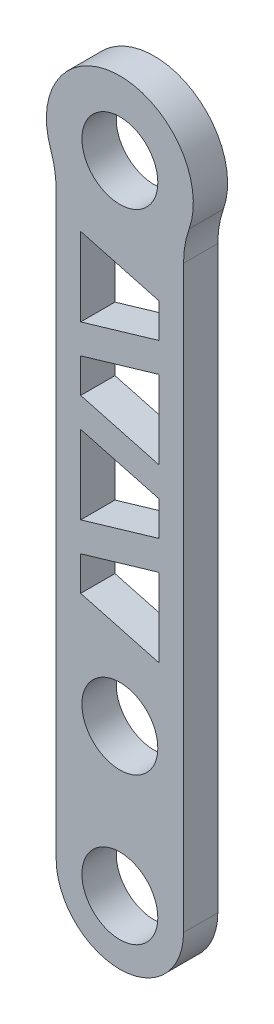
ISO-10303-21;
HEADER;
FILE_DESCRIPTION(('STEP AP214'),'2;1');
FILE_NAME('part.step','',(''),(''),'','','');
FILE_SCHEMA(('AUTOMOTIVE_DESIGN { 1 0 10303 214 1 1 1 1 }'));
ENDSEC;
DATA;
#1=APPLICATION_CONTEXT('core data for automotive mechanical design processes');
#2=APPLICATION_PROTOCOL_DEFINITION('international standard','automotive_design',2000,#1);
#3=PRODUCT_CONTEXT('',#1,'mechanical');
#4=PRODUCT('Part','Part','',(#3));
#5=PRODUCT_RELATED_PRODUCT_CATEGORY('part','',(#4));
#6=PRODUCT_DEFINITION_FORMATION('','',#4);
#7=PRODUCT_DEFINITION_CONTEXT('part definition',#1,'design');
#8=PRODUCT_DEFINITION('design','',#6,#7);
#9=PRODUCT_DEFINITION_SHAPE('','',#8);
#10=(LENGTH_UNIT() NAMED_UNIT(*) SI_UNIT(.MILLI.,.METRE.));
#11=(NAMED_UNIT(*) PLANE_ANGLE_UNIT() SI_UNIT($,.RADIAN.));
#12=(NAMED_UNIT(*) SI_UNIT($,.STERADIAN.) SOLID_ANGLE_UNIT());
#13=UNCERTAINTY_MEASURE_WITH_UNIT(LENGTH_MEASURE(1.E-05),#10,'distance_accuracy_value','');
#14=(GEOMETRIC_REPRESENTATION_CONTEXT(3) GLOBAL_UNCERTAINTY_ASSIGNED_CONTEXT((#13)) GLOBAL_UNIT_ASSIGNED_CONTEXT((#10,
#11,#12)) REPRESENTATION_CONTEXT('',''));
#15=CARTESIAN_POINT('',(0.,0.,0.));
#16=DIRECTION('',(0.,0.,1.));
#17=DIRECTION('',(1.,0.,0.));
#18=AXIS2_PLACEMENT_3D('',#15,#16,#17);
#19=CARTESIAN_POINT('',(31.8782180609369,65.8173692325044,7.));
#20=DIRECTION('',(0.,0.,-1.));
#21=DIRECTION('',(-1.,0.,0.));
#22=AXIS2_PLACEMENT_3D('',#19,#20,#21);
#23=PLANE('',#22);
#24=DIRECTION('',(0.959252946392428,0.28254873002271,0.));
#25=VECTOR('',#24,1.);
#26=CARTESIAN_POINT('',(-9.12178193906307,44.9576539892948,7.));
#27=LINE('',#26,#25);
#28=CARTESIAN_POINT('',(-9.12178193906307,44.9576539892948,7.));
#29=VERTEX_POINT('',#28);
#30=CARTESIAN_POINT('',(6.87821806093693,49.6704669103968,7.));
#31=VERTEX_POINT('',#30);
#32=EDGE_CURVE('E217',#29,#31,#27,.T.);
#33=ORIENTED_EDGE('',*,*,#32,.F.);
#34=DIRECTION('',(0.,-1.,0.));
#35=VECTOR('',#34,1.);
#36=CARTESIAN_POINT('',(-9.12178193906307,60.9576539892948,7.));
#37=LINE('',#36,#35);
#38=CARTESIAN_POINT('',(-9.12178193906307,60.9576539892948,7.));
#39=VERTEX_POINT('',#38);
#40=EDGE_CURVE('E225',#39,#29,#37,.T.);
#41=ORIENTED_EDGE('',*,*,#40,.F.);
#42=DIRECTION('',(-0.965925826289067,0.258819045102525,0.));
#43=VECTOR('',#42,1.);
#44=CARTESIAN_POINT('',(6.87821806093693,56.6704669103968,7.));
#45=LINE('',#44,#43);
#46=CARTESIAN_POINT('',(6.87821806093693,56.6704669103968,7.));
#47=VERTEX_POINT('',#46);
#48=EDGE_CURVE('E222',#47,#39,#45,.T.);
#49=ORIENTED_EDGE('',*,*,#48,.F.);
#50=DIRECTION('',(0.,1.,0.));
#51=VECTOR('',#50,1.);
#52=CARTESIAN_POINT('',(6.87821806093693,49.6704669103968,7.));
#53=LINE('',#52,#51);
#54=EDGE_CURVE('E219',#31,#47,#53,.T.);
#55=ORIENTED_EDGE('',*,*,#54,.F.);
#56=EDGE_LOOP('',(#33,#41,#49,#55));
#57=FACE_BOUND('',#56,.T.);
#58=DIRECTION('',(-0.959252946392428,-0.28254873002271,0.));
#59=VECTOR('',#58,1.);
#60=CARTESIAN_POINT('',(6.87821806093693,8.67046691039676,7.));
#61=LINE('',#60,#59);
#62=CARTESIAN_POINT('',(6.87821806093693,8.67046691039676,7.));
#63=VERTEX_POINT('',#62);
#64=CARTESIAN_POINT('',(-9.12178193906307,3.95765398929479,7.));
#65=VERTEX_POINT('',#64);
#66=EDGE_CURVE('E279',#63,#65,#61,.T.);
#67=ORIENTED_EDGE('',*,*,#66,.F.);
#68=DIRECTION('',(0.,1.,0.));
#69=VECTOR('',#68,1.);
#70=CARTESIAN_POINT('',(6.87821806093693,-7.32953308960324,7.));
#71=LINE('',#70,#69);
#72=CARTESIAN_POINT('',(6.87821806093693,-7.32953308960324,7.));
#73=VERTEX_POINT('',#72);
#74=EDGE_CURVE('E287',#73,#63,#71,.T.);
#75=ORIENTED_EDGE('',*,*,#74,.F.);
#76=DIRECTION('',(0.965925826289067,-0.258819045102525,0.));
#77=VECTOR('',#76,1.);
#78=CARTESIAN_POINT('',(-9.12178193906307,-3.04234601070521,7.));
#79=LINE('',#78,#77);
#80=CARTESIAN_POINT('',(-9.12178193906307,-3.04234601070521,7.));
#81=VERTEX_POINT('',#80);
#82=EDGE_CURVE('E284',#81,#73,#79,.T.);
#83=ORIENTED_EDGE('',*,*,#82,.F.);
#84=DIRECTION('',(0.,-1.,0.));
#85=VECTOR('',#84,1.);
#86=CARTESIAN_POINT('',(-9.12178193906307,3.95765398929479,7.));
#87=LINE('',#86,#85);
#88=EDGE_CURVE('E281',#65,#81,#87,.T.);
#89=ORIENTED_EDGE('',*,*,#88,.F.);
#90=EDGE_LOOP('',(#67,#75,#83,#89));
#91=FACE_BOUND('',#90,.T.);
#92=CARTESIAN_POINT('',(31.8782180609369,65.8173692325044,7.));
#93=DIRECTION('',(0.,0.,-1.));
#94=DIRECTION('',(-1.,0.,0.));
#95=AXIS2_PLACEMENT_3D('',#92,#93,#94);
#96=CIRCLE('',#95,20.);
#97=CARTESIAN_POINT('',(11.8782180609369,65.8173692325044,7.));
#98=VERTEX_POINT('',#97);
#99=CARTESIAN_POINT('',(13.0210752037941,72.4813142551847,7.));
#100=VERTEX_POINT('',#99);
#101=EDGE_CURVE('E328',#98,#100,#96,.T.);
#102=ORIENTED_EDGE('',*,*,#101,.T.);
#103=CARTESIAN_POINT('',(-1.12178193906307,77.4792730221949,7.));
#104=DIRECTION('',(0.,0.,1.));
#105=DIRECTION('',(1.,0.,0.));
#106=AXIS2_PLACEMENT_3D('',#103,#104,#105);
#107=CIRCLE('',#106,15.);
#108=CARTESIAN_POINT('',(-15.2646390819202,72.4813142551847,7.));
#109=VERTEX_POINT('',#108);
#110=EDGE_CURVE('E331',#100,#109,#107,.T.);
#111=ORIENTED_EDGE('',*,*,#110,.T.);
#112=CARTESIAN_POINT('',(-34.1217819390631,65.8173692325043,7.));
#113=DIRECTION('',(0.,0.,-1.));
#114=DIRECTION('',(-1.,0.,0.));
#115=AXIS2_PLACEMENT_3D('',#112,#113,#114);
#116=CIRCLE('',#115,20.);
#117=CARTESIAN_POINT('',(-14.1217819390631,65.8173692325043,7.));
#118=VERTEX_POINT('',#117);
#119=EDGE_CURVE('E334',#109,#118,#116,.T.);
#120=ORIENTED_EDGE('',*,*,#119,.T.);
#121=DIRECTION('',(0.,-1.,0.));
#122=VECTOR('',#121,1.);
#123=CARTESIAN_POINT('',(-14.1217819390631,65.8173692325043,7.));
#124=LINE('',#123,#122);
#125=CARTESIAN_POINT('',(-14.121781939063,-52.5207269778051,7.));
#126=VERTEX_POINT('',#125);
#127=EDGE_CURVE('E336',#118,#126,#124,.T.);
#128=ORIENTED_EDGE('',*,*,#127,.T.);
#129=CARTESIAN_POINT('',(-1.12178193906305,-52.5207269778051,7.));
#130=DIRECTION('',(0.,0.,1.));
#131=DIRECTION('',(1.,0.,0.));
#132=AXIS2_PLACEMENT_3D('',#129,#130,#131);
#133=CIRCLE('',#132,13.);
#134=CARTESIAN_POINT('',(11.8782180609369,-52.5207269778051,7.));
#135=VERTEX_POINT('',#134);
#136=EDGE_CURVE('E338',#126,#135,#133,.T.);
#137=ORIENTED_EDGE('',*,*,#136,.T.);
#138=DIRECTION('',(0.,1.,0.));
#139=VECTOR('',#138,1.);
#140=CARTESIAN_POINT('',(11.8782180609369,65.8173692325044,7.));
#141=LINE('',#140,#139);
#142=EDGE_CURVE('E340',#135,#98,#141,.T.);
#143=ORIENTED_EDGE('',*,*,#142,.T.);
#144=EDGE_LOOP('',(#102,#111,#120,#128,#137,#143));
#145=FACE_BOUND('',#144,.T.);
#146=CARTESIAN_POINT('',(-1.12178193906305,-52.5207269778051,7.));
#147=DIRECTION('',(0.,0.,1.));
#148=DIRECTION('',(1.,0.,0.));
#149=AXIS2_PLACEMENT_3D('',#146,#147,#148);
#150=CIRCLE('',#149,7.75);
#151=CARTESIAN_POINT('',(6.62821806093695,-52.5207269778051,7.));
#152=VERTEX_POINT('',#151);
#153=EDGE_CURVE('E322',#152,#152,#150,.T.);
#154=ORIENTED_EDGE('',*,*,#153,.F.);
#155=EDGE_LOOP('',(#154));
#156=FACE_BOUND('',#155,.T.);
#157=CARTESIAN_POINT('',(-1.12178193906306,-22.5207269778051,7.));
#158=DIRECTION('',(0.,0.,1.));
#159=DIRECTION('',(1.,0.,0.));
#160=AXIS2_PLACEMENT_3D('',#157,#158,#159);
#161=CIRCLE('',#160,7.75);
#162=CARTESIAN_POINT('',(6.62821806093695,-22.5207269778051,7.));
#163=VERTEX_POINT('',#162);
#164=EDGE_CURVE('E316',#163,#163,#161,.T.);
#165=ORIENTED_EDGE('',*,*,#164,.F.);
#166=EDGE_LOOP('',(#165));
#167=FACE_BOUND('',#166,.T.);
#168=CARTESIAN_POINT('',(-1.12178193906307,77.4792730221949,7.));
#169=DIRECTION('',(0.,0.,1.));
#170=DIRECTION('',(1.,0.,0.));
#171=AXIS2_PLACEMENT_3D('',#168,#169,#170);
#172=CIRCLE('',#171,7.75000000000001);
#173=CARTESIAN_POINT('',(6.62821806093694,77.4792730221949,7.));
#174=VERTEX_POINT('',#173);
#175=EDGE_CURVE('E310',#174,#174,#172,.T.);
#176=ORIENTED_EDGE('',*,*,#175,.F.);
#177=EDGE_LOOP('',(#176));
#178=FACE_BOUND('',#177,.T.);
#179=DIRECTION('',(-0.959252946392428,-0.28254873002271,0.));
#180=VECTOR('',#179,1.);
#181=CARTESIAN_POINT('',(6.87821806093681,43.6704669103968,7.));
#182=LINE('',#181,#180);
#183=CARTESIAN_POINT('',(6.87821806093681,43.6704669103968,7.));
#184=VERTEX_POINT('',#183);
#185=CARTESIAN_POINT('',(-9.12178193906319,38.9576539892948,7.));
#186=VERTEX_POINT('',#185);
#187=EDGE_CURVE('E248',#184,#186,#182,.T.);
#188=ORIENTED_EDGE('',*,*,#187,.F.);
#189=DIRECTION('',(0.,1.,0.));
#190=VECTOR('',#189,1.);
#191=CARTESIAN_POINT('',(6.87821806093681,27.6704669103968,7.));
#192=LINE('',#191,#190);
#193=CARTESIAN_POINT('',(6.87821806093681,27.6704669103968,7.));
#194=VERTEX_POINT('',#193);
#195=EDGE_CURVE('E256',#194,#184,#192,.T.);
#196=ORIENTED_EDGE('',*,*,#195,.F.);
#197=DIRECTION('',(0.965925826289067,-0.258819045102525,0.));
#198=VECTOR('',#197,1.);
#199=CARTESIAN_POINT('',(-9.12178193906319,31.9576539892948,7.));
#200=LINE('',#199,#198);
#201=CARTESIAN_POINT('',(-9.12178193906319,31.9576539892948,7.));
#202=VERTEX_POINT('',#201);
#203=EDGE_CURVE('E253',#202,#194,#200,.T.);
#204=ORIENTED_EDGE('',*,*,#203,.F.);
#205=DIRECTION('',(0.,-1.,0.));
#206=VECTOR('',#205,1.);
#207=CARTESIAN_POINT('',(-9.12178193906319,38.9576539892948,7.));
#208=LINE('',#207,#206);
#209=EDGE_CURVE('E250',#186,#202,#208,.T.);
#210=ORIENTED_EDGE('',*,*,#209,.F.);
#211=EDGE_LOOP('',(#188,#196,#204,#210));
#212=FACE_BOUND('',#211,.T.);
#213=DIRECTION('',(0.,1.,0.));
#214=VECTOR('',#213,1.);
#215=CARTESIAN_POINT('',(6.8782180609373,14.6704669103968,7.));
#216=LINE('',#215,#214);
#217=CARTESIAN_POINT('',(6.8782180609373,14.6704669103968,7.));
#218=VERTEX_POINT('',#217);
#219=CARTESIAN_POINT('',(6.8782180609373,21.6704669103968,7.));
#220=VERTEX_POINT('',#219);
#221=EDGE_CURVE('E181',#218,#220,#216,.T.);
#222=ORIENTED_EDGE('',*,*,#221,.F.);
#223=DIRECTION('',(0.959252946392428,0.28254873002271,0.));
#224=VECTOR('',#223,1.);
#225=CARTESIAN_POINT('',(-9.1217819390627,9.95765398929479,7.));
#226=LINE('',#225,#224);
#227=CARTESIAN_POINT('',(-9.1217819390627,9.95765398929479,7.));
#228=VERTEX_POINT('',#227);
#229=EDGE_CURVE('E203',#228,#218,#226,.T.);
#230=ORIENTED_EDGE('',*,*,#229,.F.);
#231=DIRECTION('',(0.,-1.,0.));
#232=VECTOR('',#231,1.);
#233=CARTESIAN_POINT('',(-9.12178193906271,25.9576539892948,7.));
#234=LINE('',#233,#232);
#235=CARTESIAN_POINT('',(-9.12178193906271,25.9576539892948,7.));
#236=VERTEX_POINT('',#235);
#237=EDGE_CURVE('E201',#236,#228,#234,.T.);
#238=ORIENTED_EDGE('',*,*,#237,.F.);
#239=DIRECTION('',(-0.965925826289067,0.258819045102525,0.));
#240=VECTOR('',#239,1.);
#241=CARTESIAN_POINT('',(6.8782180609373,21.6704669103968,7.));
#242=LINE('',#241,#240);
#243=EDGE_CURVE('E189',#220,#236,#242,.T.);
#244=ORIENTED_EDGE('',*,*,#243,.F.);
#245=EDGE_LOOP('',(#222,#230,#238,#244));
#246=FACE_BOUND('',#245,.T.);
#247=ADVANCED_FACE('F32',(#57,#91,#145,#156,#167,#178,#212,#246),#23,.F.);
#248=CARTESIAN_POINT('',(31.8782180609369,65.8173692325044,0.));
#249=DIRECTION('',(0.,0.,-1.));
#250=DIRECTION('',(-1.,0.,0.));
#251=AXIS2_PLACEMENT_3D('',#248,#249,#250);
#252=PLANE('',#251);
#253=CARTESIAN_POINT('',(-1.12178193906306,-22.5207269778051,0.));
#254=DIRECTION('',(0.,0.,1.));
#255=DIRECTION('',(1.,0.,0.));
#256=AXIS2_PLACEMENT_3D('',#253,#254,#255);
#257=CIRCLE('',#256,7.75);
#258=CARTESIAN_POINT('',(6.62821806093695,-22.5207269778051,0.));
#259=VERTEX_POINT('',#258);
#260=EDGE_CURVE('E313',#259,#259,#257,.T.);
#261=ORIENTED_EDGE('',*,*,#260,.T.);
#262=EDGE_LOOP('',(#261));
#263=FACE_BOUND('',#262,.T.);
#264=CARTESIAN_POINT('',(31.8782180609369,65.8173692325044,0.));
#265=DIRECTION('',(0.,0.,-1.));
#266=DIRECTION('',(-1.,0.,0.));
#267=AXIS2_PLACEMENT_3D('',#264,#265,#266);
#268=CIRCLE('',#267,20.);
#269=CARTESIAN_POINT('',(11.8782180609369,65.8173692325044,0.));
#270=VERTEX_POINT('',#269);
#271=CARTESIAN_POINT('',(13.0210752037941,72.4813142551847,0.));
#272=VERTEX_POINT('',#271);
#273=EDGE_CURVE('E325',#270,#272,#268,.T.);
#274=ORIENTED_EDGE('',*,*,#273,.F.);
#275=DIRECTION('',(0.,1.,0.));
#276=VECTOR('',#275,1.);
#277=CARTESIAN_POINT('',(11.8782180609369,65.8173692325044,0.));
#278=LINE('',#277,#276);
#279=CARTESIAN_POINT('',(11.8782180609369,-52.5207269778051,0.));
#280=VERTEX_POINT('',#279);
#281=EDGE_CURVE('E332',#280,#270,#278,.T.);
#282=ORIENTED_EDGE('',*,*,#281,.F.);
#283=CARTESIAN_POINT('',(-1.12178193906305,-52.5207269778051,0.));
#284=DIRECTION('',(0.,0.,1.));
#285=DIRECTION('',(1.,0.,0.));
#286=AXIS2_PLACEMENT_3D('',#283,#284,#285);
#287=CIRCLE('',#286,13.);
#288=CARTESIAN_POINT('',(-14.121781939063,-52.5207269778051,0.));
#289=VERTEX_POINT('',#288);
#290=EDGE_CURVE('E351',#289,#280,#287,.T.);
#291=ORIENTED_EDGE('',*,*,#290,.F.);
#292=DIRECTION('',(0.,-1.,0.));
#293=VECTOR('',#292,1.);
#294=CARTESIAN_POINT('',(-14.1217819390631,65.8173692325043,0.));
#295=LINE('',#294,#293);
#296=CARTESIAN_POINT('',(-14.1217819390631,65.8173692325043,0.));
#297=VERTEX_POINT('',#296);
#298=EDGE_CURVE('E349',#297,#289,#295,.T.);
#299=ORIENTED_EDGE('',*,*,#298,.F.);
#300=CARTESIAN_POINT('',(-34.1217819390631,65.8173692325043,0.));
#301=DIRECTION('',(0.,0.,-1.));
#302=DIRECTION('',(-1.,0.,0.));
#303=AXIS2_PLACEMENT_3D('',#300,#301,#302);
#304=CIRCLE('',#303,20.);
#305=CARTESIAN_POINT('',(-15.2646390819202,72.4813142551847,0.));
#306=VERTEX_POINT('',#305);
#307=EDGE_CURVE('E347',#306,#297,#304,.T.);
#308=ORIENTED_EDGE('',*,*,#307,.F.);
#309=CARTESIAN_POINT('',(-1.12178193906307,77.4792730221949,0.));
#310=DIRECTION('',(0.,0.,1.));
#311=DIRECTION('',(1.,0.,0.));
#312=AXIS2_PLACEMENT_3D('',#309,#310,#311);
#313=CIRCLE('',#312,15.);
#314=EDGE_CURVE('E345',#272,#306,#313,.T.);
#315=ORIENTED_EDGE('',*,*,#314,.F.);
#316=EDGE_LOOP('',(#274,#282,#291,#299,#308,#315));
#317=FACE_BOUND('',#316,.T.);
#318=CARTESIAN_POINT('',(-1.12178193906305,-52.5207269778051,0.));
#319=DIRECTION('',(0.,0.,1.));
#320=DIRECTION('',(1.,0.,0.));
#321=AXIS2_PLACEMENT_3D('',#318,#319,#320);
#322=CIRCLE('',#321,7.75);
#323=CARTESIAN_POINT('',(6.62821806093695,-52.5207269778051,0.));
#324=VERTEX_POINT('',#323);
#325=EDGE_CURVE('E319',#324,#324,#322,.T.);
#326=ORIENTED_EDGE('',*,*,#325,.T.);
#327=EDGE_LOOP('',(#326));
#328=FACE_BOUND('',#327,.T.);
#329=CARTESIAN_POINT('',(-1.12178193906307,77.4792730221949,0.));
#330=DIRECTION('',(0.,0.,1.));
#331=DIRECTION('',(1.,0.,0.));
#332=AXIS2_PLACEMENT_3D('',#329,#330,#331);
#333=CIRCLE('',#332,7.75000000000001);
#334=CARTESIAN_POINT('',(6.62821806093694,77.4792730221949,0.));
#335=VERTEX_POINT('',#334);
#336=EDGE_CURVE('E309',#335,#335,#333,.T.);
#337=ORIENTED_EDGE('',*,*,#336,.T.);
#338=EDGE_LOOP('',(#337));
#339=FACE_BOUND('',#338,.T.);
#340=DIRECTION('',(0.,1.,0.));
#341=VECTOR('',#340,1.);
#342=CARTESIAN_POINT('',(6.87821806093693,-7.32953308960324,0.));
#343=LINE('',#342,#341);
#344=CARTESIAN_POINT('',(6.87821806093693,-7.32953308960324,0.));
#345=VERTEX_POINT('',#344);
#346=CARTESIAN_POINT('',(6.87821806093693,8.67046691039676,0.));
#347=VERTEX_POINT('',#346);
#348=EDGE_CURVE('E282',#345,#347,#343,.T.);
#349=ORIENTED_EDGE('',*,*,#348,.T.);
#350=DIRECTION('',(-0.959252946392428,-0.28254873002271,0.));
#351=VECTOR('',#350,1.);
#352=CARTESIAN_POINT('',(6.87821806093693,8.67046691039676,0.));
#353=LINE('',#352,#351);
#354=CARTESIAN_POINT('',(-9.12178193906307,3.95765398929479,0.));
#355=VERTEX_POINT('',#354);
#356=EDGE_CURVE('E278',#347,#355,#353,.T.);
#357=ORIENTED_EDGE('',*,*,#356,.T.);
#358=DIRECTION('',(0.,-1.,0.));
#359=VECTOR('',#358,1.);
#360=CARTESIAN_POINT('',(-9.12178193906307,3.95765398929479,0.));
#361=LINE('',#360,#359);
#362=CARTESIAN_POINT('',(-9.12178193906307,-3.04234601070521,0.));
#363=VERTEX_POINT('',#362);
#364=EDGE_CURVE('E292',#355,#363,#361,.T.);
#365=ORIENTED_EDGE('',*,*,#364,.T.);
#366=DIRECTION('',(0.965925826289067,-0.258819045102525,0.));
#367=VECTOR('',#366,1.);
#368=CARTESIAN_POINT('',(-9.12178193906307,-3.04234601070521,0.));
#369=LINE('',#368,#367);
#370=EDGE_CURVE('E295',#363,#345,#369,.T.);
#371=ORIENTED_EDGE('',*,*,#370,.T.);
#372=EDGE_LOOP('',(#349,#357,#365,#371));
#373=FACE_BOUND('',#372,.T.);
#374=DIRECTION('',(0.,1.,0.));
#375=VECTOR('',#374,1.);
#376=CARTESIAN_POINT('',(6.87821806093681,27.6704669103968,0.));
#377=LINE('',#376,#375);
#378=CARTESIAN_POINT('',(6.87821806093681,27.6704669103968,0.));
#379=VERTEX_POINT('',#378);
#380=CARTESIAN_POINT('',(6.87821806093681,43.6704669103968,0.));
#381=VERTEX_POINT('',#380);
#382=EDGE_CURVE('E251',#379,#381,#377,.T.);
#383=ORIENTED_EDGE('',*,*,#382,.T.);
#384=DIRECTION('',(-0.959252946392428,-0.28254873002271,0.));
#385=VECTOR('',#384,1.);
#386=CARTESIAN_POINT('',(6.87821806093681,43.6704669103968,0.));
#387=LINE('',#386,#385);
#388=CARTESIAN_POINT('',(-9.12178193906319,38.9576539892948,0.));
#389=VERTEX_POINT('',#388);
#390=EDGE_CURVE('E247',#381,#389,#387,.T.);
#391=ORIENTED_EDGE('',*,*,#390,.T.);
#392=DIRECTION('',(0.,-1.,0.));
#393=VECTOR('',#392,1.);
#394=CARTESIAN_POINT('',(-9.12178193906319,38.9576539892948,0.));
#395=LINE('',#394,#393);
#396=CARTESIAN_POINT('',(-9.12178193906319,31.9576539892948,0.));
#397=VERTEX_POINT('',#396);
#398=EDGE_CURVE('E261',#389,#397,#395,.T.);
#399=ORIENTED_EDGE('',*,*,#398,.T.);
#400=DIRECTION('',(0.965925826289067,-0.258819045102525,0.));
#401=VECTOR('',#400,1.);
#402=CARTESIAN_POINT('',(-9.12178193906319,31.9576539892948,0.));
#403=LINE('',#402,#401);
#404=EDGE_CURVE('E264',#397,#379,#403,.T.);
#405=ORIENTED_EDGE('',*,*,#404,.T.);
#406=EDGE_LOOP('',(#383,#391,#399,#405));
#407=FACE_BOUND('',#406,.T.);
#408=DIRECTION('',(0.,-1.,0.));
#409=VECTOR('',#408,1.);
#410=CARTESIAN_POINT('',(-9.12178193906307,60.9576539892948,0.));
#411=LINE('',#410,#409);
#412=CARTESIAN_POINT('',(-9.12178193906307,60.9576539892948,0.));
#413=VERTEX_POINT('',#412);
#414=CARTESIAN_POINT('',(-9.12178193906307,44.9576539892948,0.));
#415=VERTEX_POINT('',#414);
#416=EDGE_CURVE('E220',#413,#415,#411,.T.);
#417=ORIENTED_EDGE('',*,*,#416,.T.);
#418=DIRECTION('',(0.959252946392428,0.28254873002271,0.));
#419=VECTOR('',#418,1.);
#420=CARTESIAN_POINT('',(-9.12178193906307,44.9576539892948,0.));
#421=LINE('',#420,#419);
#422=CARTESIAN_POINT('',(6.87821806093693,49.6704669103968,0.));
#423=VERTEX_POINT('',#422);
#424=EDGE_CURVE('E197',#415,#423,#421,.T.);
#425=ORIENTED_EDGE('',*,*,#424,.T.);
#426=DIRECTION('',(0.,1.,0.));
#427=VECTOR('',#426,1.);
#428=CARTESIAN_POINT('',(6.87821806093693,49.6704669103968,0.));
#429=LINE('',#428,#427);
#430=CARTESIAN_POINT('',(6.87821806093693,56.6704669103968,0.));
#431=VERTEX_POINT('',#430);
#432=EDGE_CURVE('E230',#423,#431,#429,.T.);
#433=ORIENTED_EDGE('',*,*,#432,.T.);
#434=DIRECTION('',(-0.965925826289067,0.258819045102525,0.));
#435=VECTOR('',#434,1.);
#436=CARTESIAN_POINT('',(6.87821806093693,56.6704669103968,0.));
#437=LINE('',#436,#435);
#438=EDGE_CURVE('E233',#431,#413,#437,.T.);
#439=ORIENTED_EDGE('',*,*,#438,.T.);
#440=EDGE_LOOP('',(#417,#425,#433,#439));
#441=FACE_BOUND('',#440,.T.);
#442=DIRECTION('',(0.959252946392428,0.28254873002271,0.));
#443=VECTOR('',#442,1.);
#444=CARTESIAN_POINT('',(-9.1217819390627,9.95765398929479,0.));
#445=LINE('',#444,#443);
#446=CARTESIAN_POINT('',(-9.1217819390627,9.95765398929479,0.));
#447=VERTEX_POINT('',#446);
#448=CARTESIAN_POINT('',(6.8782180609373,14.6704669103968,0.));
#449=VERTEX_POINT('',#448);
#450=EDGE_CURVE('E190',#447,#449,#445,.T.);
#451=ORIENTED_EDGE('',*,*,#450,.T.);
#452=DIRECTION('',(0.,1.,0.));
#453=VECTOR('',#452,1.);
#454=CARTESIAN_POINT('',(6.8782180609373,14.6704669103968,0.));
#455=LINE('',#454,#453);
#456=CARTESIAN_POINT('',(6.8782180609373,21.6704669103968,0.));
#457=VERTEX_POINT('',#456);
#458=EDGE_CURVE('E55',#449,#457,#455,.T.);
#459=ORIENTED_EDGE('',*,*,#458,.T.);
#460=DIRECTION('',(-0.965925826289067,0.258819045102525,0.));
#461=VECTOR('',#460,1.);
#462=CARTESIAN_POINT('',(6.8782180609373,21.6704669103968,0.));
#463=LINE('',#462,#461);
#464=CARTESIAN_POINT('',(-9.12178193906271,25.9576539892948,0.));
#465=VERTEX_POINT('',#464);
#466=EDGE_CURVE('E196',#457,#465,#463,.T.);
#467=ORIENTED_EDGE('',*,*,#466,.T.);
#468=DIRECTION('',(0.,-1.,0.));
#469=VECTOR('',#468,1.);
#470=CARTESIAN_POINT('',(-9.12178193906271,25.9576539892948,0.));
#471=LINE('',#470,#469);
#472=EDGE_CURVE('E209',#465,#447,#471,.T.);
#473=ORIENTED_EDGE('',*,*,#472,.T.);
#474=EDGE_LOOP('',(#451,#459,#467,#473));
#475=FACE_BOUND('',#474,.T.);
#476=ADVANCED_FACE('F375',(#263,#317,#328,#339,#373,#407,#441,#475),#252,.T.);
#477=CARTESIAN_POINT('',(31.8782180609369,65.8173692325044,7.));
#478=DIRECTION('',(0.,0.,-1.));
#479=DIRECTION('',(-1.,0.,0.));
#480=AXIS2_PLACEMENT_3D('',#477,#478,#479);
#481=CYLINDRICAL_SURFACE('',#480,20.);
#482=ORIENTED_EDGE('',*,*,#273,.T.);
#483=DIRECTION('',(0.,0.,-1.));
#484=VECTOR('',#483,1.);
#485=CARTESIAN_POINT('',(13.0210752037941,72.4813142551847,7.));
#486=LINE('',#485,#484);
#487=EDGE_CURVE('E11',#100,#272,#486,.T.);
#488=ORIENTED_EDGE('',*,*,#487,.F.);
#489=ORIENTED_EDGE('',*,*,#101,.F.);
#490=DIRECTION('',(0.,0.,-1.));
#491=VECTOR('',#490,1.);
#492=CARTESIAN_POINT('',(11.8782180609369,65.8173692325044,7.));
#493=LINE('',#492,#491);
#494=EDGE_CURVE('E342',#98,#270,#493,.T.);
#495=ORIENTED_EDGE('',*,*,#494,.T.);
#496=EDGE_LOOP('',(#482,#488,#489,#495));
#497=FACE_BOUND('',#496,.T.);
#498=ADVANCED_FACE('F34',(#497),#481,.F.);
#499=CARTESIAN_POINT('',(-1.12178193906307,77.4792730221949,7.));
#500=DIRECTION('',(0.,0.,-1.));
#501=DIRECTION('',(-1.,0.,0.));
#502=AXIS2_PLACEMENT_3D('',#499,#500,#501);
#503=CYLINDRICAL_SURFACE('',#502,15.);
#504=ORIENTED_EDGE('',*,*,#314,.T.);
#505=DIRECTION('',(0.,0.,-1.));
#506=VECTOR('',#505,1.);
#507=CARTESIAN_POINT('',(-15.2646390819202,72.4813142551847,7.));
#508=LINE('',#507,#506);
#509=EDGE_CURVE('E40',#109,#306,#508,.T.);
#510=ORIENTED_EDGE('',*,*,#509,.F.);
#511=ORIENTED_EDGE('',*,*,#110,.F.);
#512=ORIENTED_EDGE('',*,*,#487,.T.);
#513=EDGE_LOOP('',(#504,#510,#511,#512));
#514=FACE_BOUND('',#513,.T.);
#515=ADVANCED_FACE('F393',(#514),#503,.T.);
#516=CARTESIAN_POINT('',(-34.1217819390631,65.8173692325043,7.));
#517=DIRECTION('',(0.,0.,-1.));
#518=DIRECTION('',(-1.,0.,0.));
#519=AXIS2_PLACEMENT_3D('',#516,#517,#518);
#520=CYLINDRICAL_SURFACE('',#519,20.);
#521=ORIENTED_EDGE('',*,*,#307,.T.);
#522=DIRECTION('',(0.,0.,-1.));
#523=VECTOR('',#522,1.);
#524=CARTESIAN_POINT('',(-14.1217819390631,65.8173692325043,7.));
#525=LINE('',#524,#523);
#526=EDGE_CURVE('E362',#118,#297,#525,.T.);
#527=ORIENTED_EDGE('',*,*,#526,.F.);
#528=ORIENTED_EDGE('',*,*,#119,.F.);
#529=ORIENTED_EDGE('',*,*,#509,.T.);
#530=EDGE_LOOP('',(#521,#527,#528,#529));
#531=FACE_BOUND('',#530,.T.);
#532=ADVANCED_FACE('F369',(#531),#520,.F.);
#533=CARTESIAN_POINT('',(-14.1217819390631,65.8173692325043,7.));
#534=DIRECTION('',(1.,0.,0.));
#535=DIRECTION('',(0.,1.,0.));
#536=AXIS2_PLACEMENT_3D('',#533,#534,#535);
#537=PLANE('',#536);
#538=ORIENTED_EDGE('',*,*,#298,.T.);
#539=DIRECTION('',(0.,0.,-1.));
#540=VECTOR('',#539,1.);
#541=CARTESIAN_POINT('',(-14.121781939063,-52.5207269778051,7.));
#542=LINE('',#541,#540);
#543=EDGE_CURVE('E359',#126,#289,#542,.T.);
#544=ORIENTED_EDGE('',*,*,#543,.F.);
#545=ORIENTED_EDGE('',*,*,#127,.F.);
#546=ORIENTED_EDGE('',*,*,#526,.T.);
#547=EDGE_LOOP('',(#538,#544,#545,#546));
#548=FACE_BOUND('',#547,.T.);
#549=ADVANCED_FACE('F381',(#548),#537,.F.);
#550=CARTESIAN_POINT('',(-1.12178193906305,-52.5207269778051,7.));
#551=DIRECTION('',(0.,0.,-1.));
#552=DIRECTION('',(-1.,0.,0.));
#553=AXIS2_PLACEMENT_3D('',#550,#551,#552);
#554=CYLINDRICAL_SURFACE('',#553,13.);
#555=ORIENTED_EDGE('',*,*,#290,.T.);
#556=DIRECTION('',(0.,0.,-1.));
#557=VECTOR('',#556,1.);
#558=CARTESIAN_POINT('',(11.8782180609369,-52.5207269778051,7.));
#559=LINE('',#558,#557);
#560=EDGE_CURVE('E356',#135,#280,#559,.T.);
#561=ORIENTED_EDGE('',*,*,#560,.F.);
#562=ORIENTED_EDGE('',*,*,#136,.F.);
#563=ORIENTED_EDGE('',*,*,#543,.T.);
#564=EDGE_LOOP('',(#555,#561,#562,#563));
#565=FACE_BOUND('',#564,.T.);
#566=ADVANCED_FACE('F385',(#565),#554,.T.);
#567=CARTESIAN_POINT('',(11.8782180609369,65.8173692325044,7.));
#568=DIRECTION('',(-1.,0.,0.));
#569=DIRECTION('',(0.,-1.,0.));
#570=AXIS2_PLACEMENT_3D('',#567,#568,#569);
#571=PLANE('',#570);
#572=ORIENTED_EDGE('',*,*,#281,.T.);
#573=ORIENTED_EDGE('',*,*,#494,.F.);
#574=ORIENTED_EDGE('',*,*,#142,.F.);
#575=ORIENTED_EDGE('',*,*,#560,.T.);
#576=EDGE_LOOP('',(#572,#573,#574,#575));
#577=FACE_BOUND('',#576,.T.);
#578=ADVANCED_FACE('F396',(#577),#571,.F.);
#579=CARTESIAN_POINT('',(-1.12178193906305,-52.5207269778051,7.));
#580=DIRECTION('',(0.,0.,-1.));
#581=DIRECTION('',(-1.,0.,0.));
#582=AXIS2_PLACEMENT_3D('',#579,#580,#581);
#583=CYLINDRICAL_SURFACE('',#582,7.75);
#584=ORIENTED_EDGE('',*,*,#153,.T.);
#585=EDGE_LOOP('',(#584));
#586=FACE_BOUND('',#585,.T.);
#587=ORIENTED_EDGE('',*,*,#325,.F.);
#588=EDGE_LOOP('',(#587));
#589=FACE_BOUND('',#588,.T.);
#590=ADVANCED_FACE('F398',(#586,#589),#583,.F.);
#591=CARTESIAN_POINT('',(-1.12178193906306,-22.5207269778051,7.));
#592=DIRECTION('',(0.,0.,-1.));
#593=DIRECTION('',(-1.,0.,0.));
#594=AXIS2_PLACEMENT_3D('',#591,#592,#593);
#595=CYLINDRICAL_SURFACE('',#594,7.75);
#596=ORIENTED_EDGE('',*,*,#164,.T.);
#597=EDGE_LOOP('',(#596));
#598=FACE_BOUND('',#597,.T.);
#599=ORIENTED_EDGE('',*,*,#260,.F.);
#600=EDGE_LOOP('',(#599));
#601=FACE_BOUND('',#600,.T.);
#602=ADVANCED_FACE('F404',(#598,#601),#595,.F.);
#603=CARTESIAN_POINT('',(-1.12178193906307,77.4792730221949,7.));
#604=DIRECTION('',(0.,0.,-1.));
#605=DIRECTION('',(-1.,0.,0.));
#606=AXIS2_PLACEMENT_3D('',#603,#604,#605);
#607=CYLINDRICAL_SURFACE('',#606,7.75000000000001);
#608=ORIENTED_EDGE('',*,*,#175,.T.);
#609=EDGE_LOOP('',(#608));
#610=FACE_BOUND('',#609,.T.);
#611=ORIENTED_EDGE('',*,*,#336,.F.);
#612=EDGE_LOOP('',(#611));
#613=FACE_BOUND('',#612,.T.);
#614=ADVANCED_FACE('F421',(#610,#613),#607,.F.);
#615=CARTESIAN_POINT('',(6.87821806093693,8.67046691039676,7.));
#616=DIRECTION('',(0.28254873002271,-0.959252946392428,0.));
#617=DIRECTION('',(0.959252946392428,0.28254873002271,0.));
#618=AXIS2_PLACEMENT_3D('',#615,#616,#617);
#619=PLANE('',#618);
#620=ORIENTED_EDGE('',*,*,#356,.F.);
#621=DIRECTION('',(0.,0.,-1.));
#622=VECTOR('',#621,1.);
#623=CARTESIAN_POINT('',(6.87821806093693,8.67046691039676,7.));
#624=LINE('',#623,#622);
#625=EDGE_CURVE('E289',#63,#347,#624,.T.);
#626=ORIENTED_EDGE('',*,*,#625,.F.);
#627=ORIENTED_EDGE('',*,*,#66,.T.);
#628=DIRECTION('',(0.,0.,-1.));
#629=VECTOR('',#628,1.);
#630=CARTESIAN_POINT('',(-9.12178193906307,3.95765398929479,7.));
#631=LINE('',#630,#629);
#632=EDGE_CURVE('E306',#65,#355,#631,.T.);
#633=ORIENTED_EDGE('',*,*,#632,.T.);
#634=EDGE_LOOP('',(#620,#626,#627,#633));
#635=FACE_BOUND('',#634,.T.);
#636=ADVANCED_FACE('F425',(#635),#619,.T.);
#637=CARTESIAN_POINT('',(-9.12178193906307,3.95765398929479,7.));
#638=DIRECTION('',(1.,0.,0.));
#639=DIRECTION('',(0.,0.,-1.));
#640=AXIS2_PLACEMENT_3D('',#637,#638,#639);
#641=PLANE('',#640);
#642=ORIENTED_EDGE('',*,*,#364,.F.);
#643=ORIENTED_EDGE('',*,*,#632,.F.);
#644=ORIENTED_EDGE('',*,*,#88,.T.);
#645=DIRECTION('',(0.,0.,-1.));
#646=VECTOR('',#645,1.);
#647=CARTESIAN_POINT('',(-9.12178193906307,-3.04234601070521,7.));
#648=LINE('',#647,#646);
#649=EDGE_CURVE('E304',#81,#363,#648,.T.);
#650=ORIENTED_EDGE('',*,*,#649,.T.);
#651=EDGE_LOOP('',(#642,#643,#644,#650));
#652=FACE_BOUND('',#651,.T.);
#653=ADVANCED_FACE('F429',(#652),#641,.T.);
#654=CARTESIAN_POINT('',(-9.12178193906307,-3.04234601070521,7.));
#655=DIRECTION('',(0.258819045102525,0.965925826289067,0.));
#656=DIRECTION('',(-0.965925826289067,0.258819045102525,0.));
#657=AXIS2_PLACEMENT_3D('',#654,#655,#656);
#658=PLANE('',#657);
#659=ORIENTED_EDGE('',*,*,#370,.F.);
#660=ORIENTED_EDGE('',*,*,#649,.F.);
#661=ORIENTED_EDGE('',*,*,#82,.T.);
#662=DIRECTION('',(0.,0.,-1.));
#663=VECTOR('',#662,1.);
#664=CARTESIAN_POINT('',(6.87821806093693,-7.32953308960324,7.));
#665=LINE('',#664,#663);
#666=EDGE_CURVE('E302',#73,#345,#665,.T.);
#667=ORIENTED_EDGE('',*,*,#666,.T.);
#668=EDGE_LOOP('',(#659,#660,#661,#667));
#669=FACE_BOUND('',#668,.T.);
#670=ADVANCED_FACE('F433',(#669),#658,.T.);
#671=CARTESIAN_POINT('',(6.87821806093693,-7.32953308960324,7.));
#672=DIRECTION('',(-1.,0.,0.));
#673=DIRECTION('',(0.,-1.,0.));
#674=AXIS2_PLACEMENT_3D('',#671,#672,#673);
#675=PLANE('',#674);
#676=ORIENTED_EDGE('',*,*,#348,.F.);
#677=ORIENTED_EDGE('',*,*,#666,.F.);
#678=ORIENTED_EDGE('',*,*,#74,.T.);
#679=ORIENTED_EDGE('',*,*,#625,.T.);
#680=EDGE_LOOP('',(#676,#677,#678,#679));
#681=FACE_BOUND('',#680,.T.);
#682=ADVANCED_FACE('F437',(#681),#675,.T.);
#683=CARTESIAN_POINT('',(6.87821806093681,43.6704669103968,7.));
#684=DIRECTION('',(0.28254873002271,-0.959252946392428,0.));
#685=DIRECTION('',(0.959252946392428,0.28254873002271,0.));
#686=AXIS2_PLACEMENT_3D('',#683,#684,#685);
#687=PLANE('',#686);
#688=ORIENTED_EDGE('',*,*,#390,.F.);
#689=DIRECTION('',(0.,0.,-1.));
#690=VECTOR('',#689,1.);
#691=CARTESIAN_POINT('',(6.87821806093681,43.6704669103968,7.));
#692=LINE('',#691,#690);
#693=EDGE_CURVE('E258',#184,#381,#692,.T.);
#694=ORIENTED_EDGE('',*,*,#693,.F.);
#695=ORIENTED_EDGE('',*,*,#187,.T.);
#696=DIRECTION('',(0.,0.,-1.));
#697=VECTOR('',#696,1.);
#698=CARTESIAN_POINT('',(-9.12178193906319,38.9576539892948,7.));
#699=LINE('',#698,#697);
#700=EDGE_CURVE('E275',#186,#389,#699,.T.);
#701=ORIENTED_EDGE('',*,*,#700,.T.);
#702=EDGE_LOOP('',(#688,#694,#695,#701));
#703=FACE_BOUND('',#702,.T.);
#704=ADVANCED_FACE('F441',(#703),#687,.T.);
#705=CARTESIAN_POINT('',(-9.12178193906319,38.9576539892948,7.));
#706=DIRECTION('',(1.,0.,0.));
#707=DIRECTION('',(0.,0.,-1.));
#708=AXIS2_PLACEMENT_3D('',#705,#706,#707);
#709=PLANE('',#708);
#710=ORIENTED_EDGE('',*,*,#398,.F.);
#711=ORIENTED_EDGE('',*,*,#700,.F.);
#712=ORIENTED_EDGE('',*,*,#209,.T.);
#713=DIRECTION('',(0.,0.,-1.));
#714=VECTOR('',#713,1.);
#715=CARTESIAN_POINT('',(-9.12178193906319,31.9576539892948,7.));
#716=LINE('',#715,#714);
#717=EDGE_CURVE('E273',#202,#397,#716,.T.);
#718=ORIENTED_EDGE('',*,*,#717,.T.);
#719=EDGE_LOOP('',(#710,#711,#712,#718));
#720=FACE_BOUND('',#719,.T.);
#721=ADVANCED_FACE('F445',(#720),#709,.T.);
#722=CARTESIAN_POINT('',(-9.12178193906319,31.9576539892948,7.));
#723=DIRECTION('',(0.258819045102525,0.965925826289067,0.));
#724=DIRECTION('',(-0.965925826289067,0.258819045102525,0.));
#725=AXIS2_PLACEMENT_3D('',#722,#723,#724);
#726=PLANE('',#725);
#727=ORIENTED_EDGE('',*,*,#404,.F.);
#728=ORIENTED_EDGE('',*,*,#717,.F.);
#729=ORIENTED_EDGE('',*,*,#203,.T.);
#730=DIRECTION('',(0.,0.,-1.));
#731=VECTOR('',#730,1.);
#732=CARTESIAN_POINT('',(6.87821806093681,27.6704669103968,7.));
#733=LINE('',#732,#731);
#734=EDGE_CURVE('E271',#194,#379,#733,.T.);
#735=ORIENTED_EDGE('',*,*,#734,.T.);
#736=EDGE_LOOP('',(#727,#728,#729,#735));
#737=FACE_BOUND('',#736,.T.);
#738=ADVANCED_FACE('F449',(#737),#726,.T.);
#739=CARTESIAN_POINT('',(6.87821806093681,27.6704669103968,7.));
#740=DIRECTION('',(-1.,0.,0.));
#741=DIRECTION('',(0.,-1.,0.));
#742=AXIS2_PLACEMENT_3D('',#739,#740,#741);
#743=PLANE('',#742);
#744=ORIENTED_EDGE('',*,*,#382,.F.);
#745=ORIENTED_EDGE('',*,*,#734,.F.);
#746=ORIENTED_EDGE('',*,*,#195,.T.);
#747=ORIENTED_EDGE('',*,*,#693,.T.);
#748=EDGE_LOOP('',(#744,#745,#746,#747));
#749=FACE_BOUND('',#748,.T.);
#750=ADVANCED_FACE('F453',(#749),#743,.T.);
#751=CARTESIAN_POINT('',(-9.12178193906307,44.9576539892948,7.));
#752=DIRECTION('',(-0.28254873002271,0.959252946392428,0.));
#753=DIRECTION('',(-0.959252946392428,-0.28254873002271,0.));
#754=AXIS2_PLACEMENT_3D('',#751,#752,#753);
#755=PLANE('',#754);
#756=ORIENTED_EDGE('',*,*,#424,.F.);
#757=DIRECTION('',(0.,0.,-1.));
#758=VECTOR('',#757,1.);
#759=CARTESIAN_POINT('',(-9.12178193906307,44.9576539892948,7.));
#760=LINE('',#759,#758);
#761=EDGE_CURVE('E227',#29,#415,#760,.T.);
#762=ORIENTED_EDGE('',*,*,#761,.F.);
#763=ORIENTED_EDGE('',*,*,#32,.T.);
#764=DIRECTION('',(0.,0.,-1.));
#765=VECTOR('',#764,1.);
#766=CARTESIAN_POINT('',(6.87821806093693,49.6704669103968,7.));
#767=LINE('',#766,#765);
#768=EDGE_CURVE('E244',#31,#423,#767,.T.);
#769=ORIENTED_EDGE('',*,*,#768,.T.);
#770=EDGE_LOOP('',(#756,#762,#763,#769));
#771=FACE_BOUND('',#770,.T.);
#772=ADVANCED_FACE('F457',(#771),#755,.T.);
#773=CARTESIAN_POINT('',(6.87821806093693,49.6704669103968,7.));
#774=DIRECTION('',(-1.,0.,0.));
#775=DIRECTION('',(0.,0.,1.));
#776=AXIS2_PLACEMENT_3D('',#773,#774,#775);
#777=PLANE('',#776);
#778=ORIENTED_EDGE('',*,*,#432,.F.);
#779=ORIENTED_EDGE('',*,*,#768,.F.);
#780=ORIENTED_EDGE('',*,*,#54,.T.);
#781=DIRECTION('',(0.,0.,-1.));
#782=VECTOR('',#781,1.);
#783=CARTESIAN_POINT('',(6.87821806093693,56.6704669103968,7.));
#784=LINE('',#783,#782);
#785=EDGE_CURVE('E242',#47,#431,#784,.T.);
#786=ORIENTED_EDGE('',*,*,#785,.T.);
#787=EDGE_LOOP('',(#778,#779,#780,#786));
#788=FACE_BOUND('',#787,.T.);
#789=ADVANCED_FACE('F461',(#788),#777,.T.);
#790=CARTESIAN_POINT('',(6.87821806093693,56.6704669103968,7.));
#791=DIRECTION('',(-0.258819045102525,-0.965925826289067,0.));
#792=DIRECTION('',(0.965925826289067,-0.258819045102525,0.));
#793=AXIS2_PLACEMENT_3D('',#790,#791,#792);
#794=PLANE('',#793);
#795=ORIENTED_EDGE('',*,*,#438,.F.);
#796=ORIENTED_EDGE('',*,*,#785,.F.);
#797=ORIENTED_EDGE('',*,*,#48,.T.);
#798=DIRECTION('',(0.,0.,-1.));
#799=VECTOR('',#798,1.);
#800=CARTESIAN_POINT('',(-9.12178193906307,60.9576539892948,7.));
#801=LINE('',#800,#799);
#802=EDGE_CURVE('E240',#39,#413,#801,.T.);
#803=ORIENTED_EDGE('',*,*,#802,.T.);
#804=EDGE_LOOP('',(#795,#796,#797,#803));
#805=FACE_BOUND('',#804,.T.);
#806=ADVANCED_FACE('F465',(#805),#794,.T.);
#807=CARTESIAN_POINT('',(-9.12178193906307,60.9576539892948,7.));
#808=DIRECTION('',(1.,0.,0.));
#809=DIRECTION('',(0.,1.,0.));
#810=AXIS2_PLACEMENT_3D('',#807,#808,#809);
#811=PLANE('',#810);
#812=ORIENTED_EDGE('',*,*,#416,.F.);
#813=ORIENTED_EDGE('',*,*,#802,.F.);
#814=ORIENTED_EDGE('',*,*,#40,.T.);
#815=ORIENTED_EDGE('',*,*,#761,.T.);
#816=EDGE_LOOP('',(#812,#813,#814,#815));
#817=FACE_BOUND('',#816,.T.);
#818=ADVANCED_FACE('F469',(#817),#811,.T.);
#819=CARTESIAN_POINT('',(6.8782180609373,14.6704669103968,7.));
#820=DIRECTION('',(-1.,0.,0.));
#821=DIRECTION('',(0.,0.,1.));
#822=AXIS2_PLACEMENT_3D('',#819,#820,#821);
#823=PLANE('',#822);
#824=ORIENTED_EDGE('',*,*,#458,.F.);
#825=DIRECTION('',(0.,0.,-1.));
#826=VECTOR('',#825,1.);
#827=CARTESIAN_POINT('',(6.8782180609373,14.6704669103968,7.));
#828=LINE('',#827,#826);
#829=EDGE_CURVE('E185',#218,#449,#828,.T.);
#830=ORIENTED_EDGE('',*,*,#829,.F.);
#831=ORIENTED_EDGE('',*,*,#221,.T.);
#832=DIRECTION('',(0.,0.,-1.));
#833=VECTOR('',#832,1.);
#834=CARTESIAN_POINT('',(6.8782180609373,21.6704669103968,7.));
#835=LINE('',#834,#833);
#836=EDGE_CURVE('E184',#220,#457,#835,.T.);
#837=ORIENTED_EDGE('',*,*,#836,.T.);
#838=EDGE_LOOP('',(#824,#830,#831,#837));
#839=FACE_BOUND('',#838,.T.);
#840=ADVANCED_FACE('F183',(#839),#823,.T.);
#841=CARTESIAN_POINT('',(6.8782180609373,21.6704669103968,7.));
#842=DIRECTION('',(-0.258819045102525,-0.965925826289067,0.));
#843=DIRECTION('',(0.965925826289067,-0.258819045102525,0.));
#844=AXIS2_PLACEMENT_3D('',#841,#842,#843);
#845=PLANE('',#844);
#846=ORIENTED_EDGE('',*,*,#466,.F.);
#847=ORIENTED_EDGE('',*,*,#836,.F.);
#848=ORIENTED_EDGE('',*,*,#243,.T.);
#849=DIRECTION('',(0.,0.,-1.));
#850=VECTOR('',#849,1.);
#851=CARTESIAN_POINT('',(-9.12178193906271,25.9576539892948,7.));
#852=LINE('',#851,#850);
#853=EDGE_CURVE('E198',#236,#465,#852,.T.);
#854=ORIENTED_EDGE('',*,*,#853,.T.);
#855=EDGE_LOOP('',(#846,#847,#848,#854));
#856=FACE_BOUND('',#855,.T.);
#857=ADVANCED_FACE('F193',(#856),#845,.T.);
#858=CARTESIAN_POINT('',(-9.12178193906271,25.9576539892948,7.));
#859=DIRECTION('',(1.,0.,0.));
#860=DIRECTION('',(0.,1.,0.));
#861=AXIS2_PLACEMENT_3D('',#858,#859,#860);
#862=PLANE('',#861);
#863=ORIENTED_EDGE('',*,*,#472,.F.);
#864=ORIENTED_EDGE('',*,*,#853,.F.);
#865=ORIENTED_EDGE('',*,*,#237,.T.);
#866=DIRECTION('',(0.,0.,-1.));
#867=VECTOR('',#866,1.);
#868=CARTESIAN_POINT('',(-9.1217819390627,9.95765398929479,7.));
#869=LINE('',#868,#867);
#870=EDGE_CURVE('E47',#228,#447,#869,.T.);
#871=ORIENTED_EDGE('',*,*,#870,.T.);
#872=EDGE_LOOP('',(#863,#864,#865,#871));
#873=FACE_BOUND('',#872,.T.);
#874=ADVANCED_FACE('F478',(#873),#862,.T.);
#875=CARTESIAN_POINT('',(-9.1217819390627,9.95765398929479,7.));
#876=DIRECTION('',(-0.28254873002271,0.959252946392428,0.));
#877=DIRECTION('',(-0.959252946392428,-0.28254873002271,0.));
#878=AXIS2_PLACEMENT_3D('',#875,#876,#877);
#879=PLANE('',#878);
#880=ORIENTED_EDGE('',*,*,#450,.F.);
#881=ORIENTED_EDGE('',*,*,#870,.F.);
#882=ORIENTED_EDGE('',*,*,#229,.T.);
#883=ORIENTED_EDGE('',*,*,#829,.T.);
#884=EDGE_LOOP('',(#880,#881,#882,#883));
#885=FACE_BOUND('',#884,.T.);
#886=ADVANCED_FACE('F481',(#885),#879,.T.);
#887=CLOSED_SHELL('',(#247,#476,#498,#515,#532,#549,#566,#578,#590,#602,#614,#636,#653,#670,
#682,#704,#721,#738,#750,#772,#789,#806,#818,#840,#857,#874,#886));
#888=MANIFOLD_SOLID_BREP('B2',#887);
#889=ADVANCED_BREP_SHAPE_REPRESENTATION('',(#18,#888),#14);
#890=SHAPE_DEFINITION_REPRESENTATION(#9,#889);
ENDSEC;
END-ISO-10303-21;
